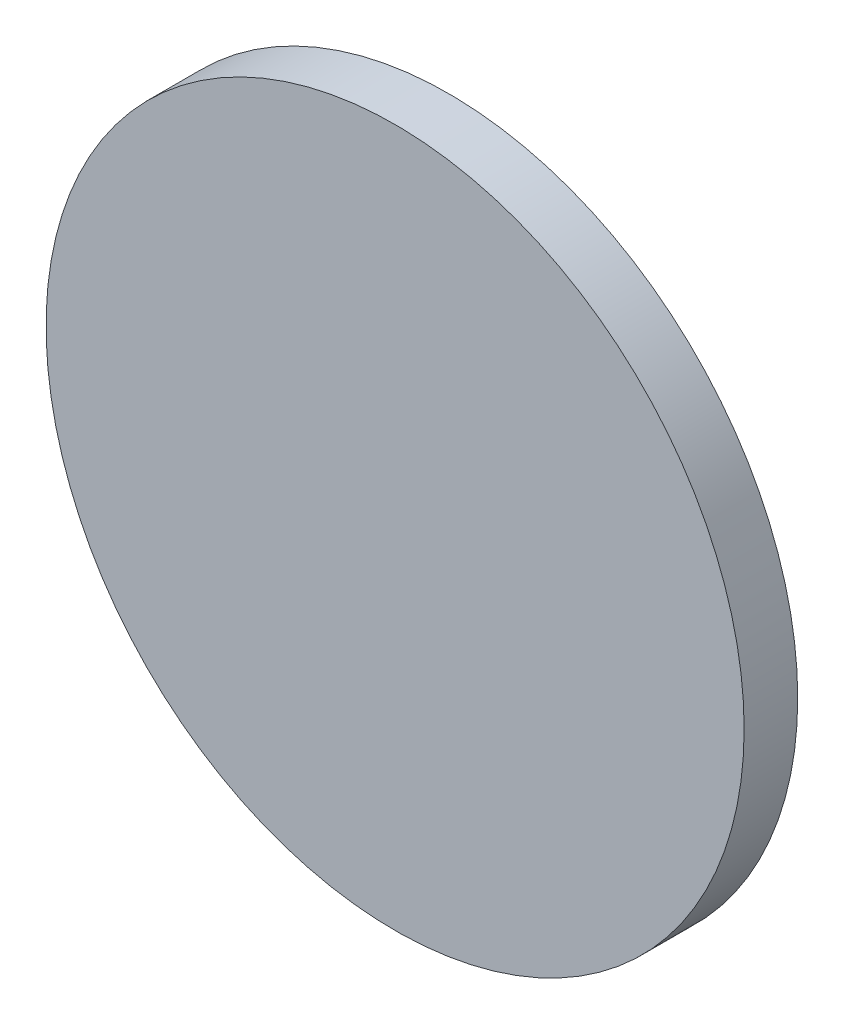
ISO-10303-21;
HEADER;
FILE_DESCRIPTION(('STEP AP214'),'2;1');
FILE_NAME('part.step','',(''),(''),'','','');
FILE_SCHEMA(('AUTOMOTIVE_DESIGN { 1 0 10303 214 1 1 1 1 }'));
ENDSEC;
DATA;
#1=APPLICATION_CONTEXT('core data for automotive mechanical design processes');
#2=APPLICATION_PROTOCOL_DEFINITION('international standard','automotive_design',2000,#1);
#3=PRODUCT_CONTEXT('',#1,'mechanical');
#4=PRODUCT('Part','Part','',(#3));
#5=PRODUCT_RELATED_PRODUCT_CATEGORY('part','',(#4));
#6=PRODUCT_DEFINITION_FORMATION('','',#4);
#7=PRODUCT_DEFINITION_CONTEXT('part definition',#1,'design');
#8=PRODUCT_DEFINITION('design','',#6,#7);
#9=PRODUCT_DEFINITION_SHAPE('','',#8);
#10=(LENGTH_UNIT() NAMED_UNIT(*) SI_UNIT(.MILLI.,.METRE.));
#11=(NAMED_UNIT(*) PLANE_ANGLE_UNIT() SI_UNIT($,.RADIAN.));
#12=(NAMED_UNIT(*) SI_UNIT($,.STERADIAN.) SOLID_ANGLE_UNIT());
#13=UNCERTAINTY_MEASURE_WITH_UNIT(LENGTH_MEASURE(1.E-05),#10,'distance_accuracy_value','');
#14=(GEOMETRIC_REPRESENTATION_CONTEXT(3) GLOBAL_UNCERTAINTY_ASSIGNED_CONTEXT((#13)) GLOBAL_UNIT_ASSIGNED_CONTEXT((#10,
#11,#12)) REPRESENTATION_CONTEXT('',''));
#15=CARTESIAN_POINT('',(0.,0.,0.));
#16=DIRECTION('',(0.,0.,1.));
#17=DIRECTION('',(1.,0.,0.));
#18=AXIS2_PLACEMENT_3D('',#15,#16,#17);
#19=CARTESIAN_POINT('',(0.,41.004,5.));
#20=DIRECTION('',(0.,0.,1.));
#21=DIRECTION('',(1.,0.,0.));
#22=AXIS2_PLACEMENT_3D('',#19,#20,#21);
#23=PLANE('',#22);
#24=CARTESIAN_POINT('',(0.,0.,5.));
#25=DIRECTION('',(0.,0.,1.));
#26=DIRECTION('',(1.,0.,0.));
#27=AXIS2_PLACEMENT_3D('',#24,#25,#26);
#28=CIRCLE('',#27,20.);
#29=CARTESIAN_POINT('',(20.,0.,5.));
#30=VERTEX_POINT('',#29);
#31=EDGE_CURVE('E17',#30,#30,#28,.F.);
#32=ORIENTED_EDGE('',*,*,#31,.F.);
#33=EDGE_LOOP('',(#32));
#34=FACE_BOUND('',#33,.T.);
#35=ADVANCED_FACE('F14',(#34),#23,.T.);
#36=CARTESIAN_POINT('',(0.,0.,1.92984854399016));
#37=DIRECTION('',(0.,0.,1.));
#38=DIRECTION('',(1.,0.,0.));
#39=AXIS2_PLACEMENT_3D('',#36,#37,#38);
#40=CYLINDRICAL_SURFACE('',#39,20.);
#41=CARTESIAN_POINT('',(0.,0.,1.92984854399016));
#42=DIRECTION('',(0.,0.,1.));
#43=DIRECTION('',(1.,0.,0.));
#44=AXIS2_PLACEMENT_3D('',#41,#42,#43);
#45=CIRCLE('',#44,20.);
#46=CARTESIAN_POINT('',(20.,0.,1.92984854399016));
#47=VERTEX_POINT('',#46);
#48=EDGE_CURVE('E10',#47,#47,#45,.F.);
#49=ORIENTED_EDGE('',*,*,#48,.F.);
#50=EDGE_LOOP('',(#49));
#51=FACE_BOUND('',#50,.T.);
#52=ORIENTED_EDGE('',*,*,#31,.T.);
#53=EDGE_LOOP('',(#52));
#54=FACE_BOUND('',#53,.T.);
#55=ADVANCED_FACE('F32',(#51,#54),#40,.T.);
#56=CARTESIAN_POINT('',(0.,0.,104.6));
#57=DIRECTION('',(0.,-1.,0.));
#58=DIRECTION('',(0.,0.,-1.));
#59=AXIS2_PLACEMENT_3D('',#56,#57,#58);
#60=SPHERICAL_SURFACE('',#59,104.6);
#61=ORIENTED_EDGE('',*,*,#48,.T.);
#62=EDGE_LOOP('',(#61));
#63=FACE_BOUND('',#62,.T.);
#64=ADVANCED_FACE('F30',(#63),#60,.T.);
#65=CLOSED_SHELL('',(#35,#55,#64));
#66=MANIFOLD_SOLID_BREP('B1',#65);
#67=ADVANCED_BREP_SHAPE_REPRESENTATION('',(#18,#66),#14);
#68=SHAPE_DEFINITION_REPRESENTATION(#9,#67);
ENDSEC;
END-ISO-10303-21;
